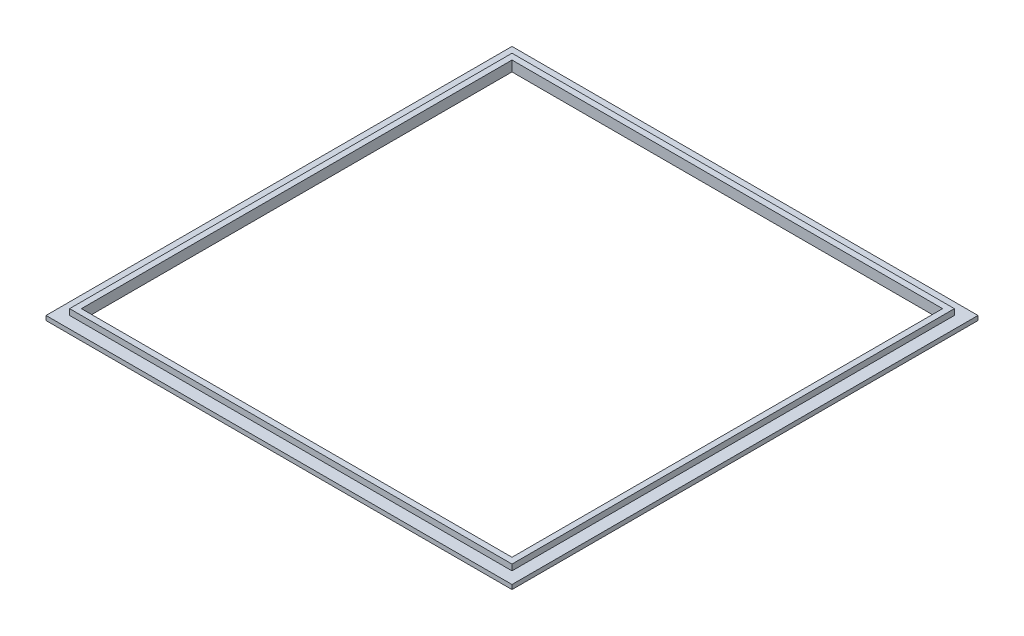
ISO-10303-21;
HEADER;
FILE_DESCRIPTION(('STEP AP214'),'2;1');
FILE_NAME('part.step','',(''),(''),'','','');
FILE_SCHEMA(('AUTOMOTIVE_DESIGN { 1 0 10303 214 1 1 1 1 }'));
ENDSEC;
DATA;
#1=APPLICATION_CONTEXT('core data for automotive mechanical design processes');
#2=APPLICATION_PROTOCOL_DEFINITION('international standard','automotive_design',2000,#1);
#3=PRODUCT_CONTEXT('',#1,'mechanical');
#4=PRODUCT('Part','Part','',(#3));
#5=PRODUCT_RELATED_PRODUCT_CATEGORY('part','',(#4));
#6=PRODUCT_DEFINITION_FORMATION('','',#4);
#7=PRODUCT_DEFINITION_CONTEXT('part definition',#1,'design');
#8=PRODUCT_DEFINITION('design','',#6,#7);
#9=PRODUCT_DEFINITION_SHAPE('','',#8);
#10=(LENGTH_UNIT() NAMED_UNIT(*) SI_UNIT(.MILLI.,.METRE.));
#11=(NAMED_UNIT(*) PLANE_ANGLE_UNIT() SI_UNIT($,.RADIAN.));
#12=(NAMED_UNIT(*) SI_UNIT($,.STERADIAN.) SOLID_ANGLE_UNIT());
#13=UNCERTAINTY_MEASURE_WITH_UNIT(LENGTH_MEASURE(1.E-05),#10,'distance_accuracy_value','');
#14=(GEOMETRIC_REPRESENTATION_CONTEXT(3) GLOBAL_UNCERTAINTY_ASSIGNED_CONTEXT((#13)) GLOBAL_UNIT_ASSIGNED_CONTEXT((#10,
#11,#12)) REPRESENTATION_CONTEXT('',''));
#15=CARTESIAN_POINT('',(0.,0.,0.));
#16=DIRECTION('',(0.,0.,1.));
#17=DIRECTION('',(1.,0.,0.));
#18=AXIS2_PLACEMENT_3D('',#15,#16,#17);
#19=CARTESIAN_POINT('',(0.,1.5,0.));
#20=DIRECTION('',(0.,1.,0.));
#21=DIRECTION('',(0.,0.,1.));
#22=AXIS2_PLACEMENT_3D('',#19,#20,#21);
#23=PLANE('',#22);
#24=DIRECTION('',(1.,0.,0.));
#25=VECTOR('',#24,1.);
#26=CARTESIAN_POINT('',(-6.,1.5,6.));
#27=LINE('',#26,#25);
#28=CARTESIAN_POINT('',(-6.,1.5,6.));
#29=VERTEX_POINT('',#28);
#30=CARTESIAN_POINT('',(152.,1.5,6.));
#31=VERTEX_POINT('',#30);
#32=EDGE_CURVE('E193',#29,#31,#27,.T.);
#33=ORIENTED_EDGE('',*,*,#32,.T.);
#34=DIRECTION('',(0.,0.,-1.));
#35=VECTOR('',#34,1.);
#36=CARTESIAN_POINT('',(152.,1.5,6.));
#37=LINE('',#36,#35);
#38=CARTESIAN_POINT('',(152.,1.5,-152.));
#39=VERTEX_POINT('',#38);
#40=EDGE_CURVE('E196',#31,#39,#37,.T.);
#41=ORIENTED_EDGE('',*,*,#40,.T.);
#42=DIRECTION('',(-1.,0.,0.));
#43=VECTOR('',#42,1.);
#44=CARTESIAN_POINT('',(-6.,1.5,-152.));
#45=LINE('',#44,#43);
#46=CARTESIAN_POINT('',(-6.,1.5,-152.));
#47=VERTEX_POINT('',#46);
#48=EDGE_CURVE('E199',#39,#47,#45,.T.);
#49=ORIENTED_EDGE('',*,*,#48,.T.);
#50=DIRECTION('',(0.,0.,1.));
#51=VECTOR('',#50,1.);
#52=CARTESIAN_POINT('',(-6.,1.5,6.));
#53=LINE('',#52,#51);
#54=EDGE_CURVE('E201',#47,#29,#53,.T.);
#55=ORIENTED_EDGE('',*,*,#54,.T.);
#56=EDGE_LOOP('',(#33,#41,#49,#55));
#57=FACE_BOUND('',#56,.T.);
#58=DIRECTION('',(-1.,0.,0.));
#59=VECTOR('',#58,1.);
#60=CARTESIAN_POINT('',(148.,1.5,-148.));
#61=LINE('',#60,#59);
#62=CARTESIAN_POINT('',(148.,1.5,-148.));
#63=VERTEX_POINT('',#62);
#64=CARTESIAN_POINT('',(-2.,1.5,-148.));
#65=VERTEX_POINT('',#64);
#66=EDGE_CURVE('E168',#63,#65,#61,.T.);
#67=ORIENTED_EDGE('',*,*,#66,.F.);
#68=DIRECTION('',(0.,0.,-1.));
#69=VECTOR('',#68,1.);
#70=CARTESIAN_POINT('',(148.,1.5,1.99999999999999));
#71=LINE('',#70,#69);
#72=CARTESIAN_POINT('',(148.,1.5,1.99999999999999));
#73=VERTEX_POINT('',#72);
#74=EDGE_CURVE('E154',#73,#63,#71,.T.);
#75=ORIENTED_EDGE('',*,*,#74,.F.);
#76=DIRECTION('',(1.,0.,0.));
#77=VECTOR('',#76,1.);
#78=CARTESIAN_POINT('',(-1.99999999999998,1.5,2.));
#79=LINE('',#78,#77);
#80=CARTESIAN_POINT('',(-1.99999999999998,1.5,2.));
#81=VERTEX_POINT('',#80);
#82=EDGE_CURVE('E159',#81,#73,#79,.T.);
#83=ORIENTED_EDGE('',*,*,#82,.F.);
#84=DIRECTION('',(0.,0.,1.));
#85=VECTOR('',#84,1.);
#86=CARTESIAN_POINT('',(-2.,1.5,-148.));
#87=LINE('',#86,#85);
#88=EDGE_CURVE('E170',#65,#81,#87,.T.);
#89=ORIENTED_EDGE('',*,*,#88,.F.);
#90=EDGE_LOOP('',(#67,#75,#83,#89));
#91=FACE_BOUND('',#90,.T.);
#92=ADVANCED_FACE('F35',(#57,#91),#23,.T.);
#93=CARTESIAN_POINT('',(0.,0.,0.));
#94=DIRECTION('',(0.,1.,0.));
#95=DIRECTION('',(0.,0.,1.));
#96=AXIS2_PLACEMENT_3D('',#93,#94,#95);
#97=PLANE('',#96);
#98=DIRECTION('',(1.,0.,0.));
#99=VECTOR('',#98,1.);
#100=CARTESIAN_POINT('',(-6.,0.,6.));
#101=LINE('',#100,#99);
#102=CARTESIAN_POINT('',(-6.,0.,6.));
#103=VERTEX_POINT('',#102);
#104=CARTESIAN_POINT('',(152.,0.,6.));
#105=VERTEX_POINT('',#104);
#106=EDGE_CURVE('E192',#103,#105,#101,.T.);
#107=ORIENTED_EDGE('',*,*,#106,.F.);
#108=DIRECTION('',(0.,0.,1.));
#109=VECTOR('',#108,1.);
#110=CARTESIAN_POINT('',(-6.,0.,6.));
#111=LINE('',#110,#109);
#112=CARTESIAN_POINT('',(-6.,0.,-152.));
#113=VERTEX_POINT('',#112);
#114=EDGE_CURVE('E197',#113,#103,#111,.T.);
#115=ORIENTED_EDGE('',*,*,#114,.F.);
#116=DIRECTION('',(-1.,0.,0.));
#117=VECTOR('',#116,1.);
#118=CARTESIAN_POINT('',(-6.,0.,-152.));
#119=LINE('',#118,#117);
#120=CARTESIAN_POINT('',(152.,0.,-152.));
#121=VERTEX_POINT('',#120);
#122=EDGE_CURVE('E208',#121,#113,#119,.T.);
#123=ORIENTED_EDGE('',*,*,#122,.F.);
#124=DIRECTION('',(0.,0.,-1.));
#125=VECTOR('',#124,1.);
#126=CARTESIAN_POINT('',(152.,0.,6.));
#127=LINE('',#126,#125);
#128=EDGE_CURVE('E206',#105,#121,#127,.T.);
#129=ORIENTED_EDGE('',*,*,#128,.F.);
#130=EDGE_LOOP('',(#107,#115,#123,#129));
#131=FACE_BOUND('',#130,.T.);
#132=DIRECTION('',(0.,0.,1.));
#133=VECTOR('',#132,1.);
#134=CARTESIAN_POINT('',(0.,0.,0.));
#135=LINE('',#134,#133);
#136=CARTESIAN_POINT('',(0.,0.,-146.));
#137=VERTEX_POINT('',#136);
#138=CARTESIAN_POINT('',(0.,0.,0.));
#139=VERTEX_POINT('',#138);
#140=EDGE_CURVE('E58',#137,#139,#135,.T.);
#141=ORIENTED_EDGE('',*,*,#140,.T.);
#142=DIRECTION('',(1.,0.,0.));
#143=VECTOR('',#142,1.);
#144=CARTESIAN_POINT('',(0.,0.,0.));
#145=LINE('',#144,#143);
#146=CARTESIAN_POINT('',(146.,0.,0.));
#147=VERTEX_POINT('',#146);
#148=EDGE_CURVE('E182',#139,#147,#145,.T.);
#149=ORIENTED_EDGE('',*,*,#148,.T.);
#150=DIRECTION('',(0.,0.,-1.));
#151=VECTOR('',#150,1.);
#152=CARTESIAN_POINT('',(146.,0.,0.));
#153=LINE('',#152,#151);
#154=CARTESIAN_POINT('',(146.,0.,-146.));
#155=VERTEX_POINT('',#154);
#156=EDGE_CURVE('E133',#147,#155,#153,.T.);
#157=ORIENTED_EDGE('',*,*,#156,.T.);
#158=DIRECTION('',(-1.,0.,0.));
#159=VECTOR('',#158,1.);
#160=CARTESIAN_POINT('',(0.,0.,-146.));
#161=LINE('',#160,#159);
#162=EDGE_CURVE('E185',#155,#137,#161,.T.);
#163=ORIENTED_EDGE('',*,*,#162,.T.);
#164=EDGE_LOOP('',(#141,#149,#157,#163));
#165=FACE_BOUND('',#164,.T.);
#166=ADVANCED_FACE('F226',(#131,#165),#97,.F.);
#167=CARTESIAN_POINT('',(-6.,1.5,6.));
#168=DIRECTION('',(0.,0.,-1.));
#169=DIRECTION('',(-1.,0.,0.));
#170=AXIS2_PLACEMENT_3D('',#167,#168,#169);
#171=PLANE('',#170);
#172=ORIENTED_EDGE('',*,*,#106,.T.);
#173=DIRECTION('',(0.,-1.,0.));
#174=VECTOR('',#173,1.);
#175=CARTESIAN_POINT('',(152.,1.5,6.));
#176=LINE('',#175,#174);
#177=EDGE_CURVE('E11',#31,#105,#176,.T.);
#178=ORIENTED_EDGE('',*,*,#177,.F.);
#179=ORIENTED_EDGE('',*,*,#32,.F.);
#180=DIRECTION('',(0.,-1.,0.));
#181=VECTOR('',#180,1.);
#182=CARTESIAN_POINT('',(-6.,1.5,6.));
#183=LINE('',#182,#181);
#184=EDGE_CURVE('E203',#29,#103,#183,.T.);
#185=ORIENTED_EDGE('',*,*,#184,.T.);
#186=EDGE_LOOP('',(#172,#178,#179,#185));
#187=FACE_BOUND('',#186,.T.);
#188=ADVANCED_FACE('F37',(#187),#171,.F.);
#189=CARTESIAN_POINT('',(152.,1.5,6.));
#190=DIRECTION('',(-1.,0.,0.));
#191=DIRECTION('',(0.,0.,1.));
#192=AXIS2_PLACEMENT_3D('',#189,#190,#191);
#193=PLANE('',#192);
#194=ORIENTED_EDGE('',*,*,#128,.T.);
#195=DIRECTION('',(0.,-1.,0.));
#196=VECTOR('',#195,1.);
#197=CARTESIAN_POINT('',(152.,1.5,-152.));
#198=LINE('',#197,#196);
#199=EDGE_CURVE('E43',#39,#121,#198,.T.);
#200=ORIENTED_EDGE('',*,*,#199,.F.);
#201=ORIENTED_EDGE('',*,*,#40,.F.);
#202=ORIENTED_EDGE('',*,*,#177,.T.);
#203=EDGE_LOOP('',(#194,#200,#201,#202));
#204=FACE_BOUND('',#203,.T.);
#205=ADVANCED_FACE('F237',(#204),#193,.F.);
#206=CARTESIAN_POINT('',(-6.,1.5,-152.));
#207=DIRECTION('',(0.,0.,1.));
#208=DIRECTION('',(1.,0.,0.));
#209=AXIS2_PLACEMENT_3D('',#206,#207,#208);
#210=PLANE('',#209);
#211=ORIENTED_EDGE('',*,*,#122,.T.);
#212=DIRECTION('',(0.,-1.,0.));
#213=VECTOR('',#212,1.);
#214=CARTESIAN_POINT('',(-6.,1.5,-152.));
#215=LINE('',#214,#213);
#216=EDGE_CURVE('E213',#47,#113,#215,.T.);
#217=ORIENTED_EDGE('',*,*,#216,.F.);
#218=ORIENTED_EDGE('',*,*,#48,.F.);
#219=ORIENTED_EDGE('',*,*,#199,.T.);
#220=EDGE_LOOP('',(#211,#217,#218,#219));
#221=FACE_BOUND('',#220,.T.);
#222=ADVANCED_FACE('F220',(#221),#210,.F.);
#223=CARTESIAN_POINT('',(-6.,1.5,6.));
#224=DIRECTION('',(1.,0.,0.));
#225=DIRECTION('',(0.,0.,-1.));
#226=AXIS2_PLACEMENT_3D('',#223,#224,#225);
#227=PLANE('',#226);
#228=ORIENTED_EDGE('',*,*,#114,.T.);
#229=ORIENTED_EDGE('',*,*,#184,.F.);
#230=ORIENTED_EDGE('',*,*,#54,.F.);
#231=ORIENTED_EDGE('',*,*,#216,.T.);
#232=EDGE_LOOP('',(#228,#229,#230,#231));
#233=FACE_BOUND('',#232,.T.);
#234=ADVANCED_FACE('F230',(#233),#227,.F.);
#235=CARTESIAN_POINT('',(0.,1.5,0.));
#236=DIRECTION('',(1.,0.,0.));
#237=DIRECTION('',(0.,0.,-1.));
#238=AXIS2_PLACEMENT_3D('',#235,#236,#237);
#239=PLANE('',#238);
#240=ORIENTED_EDGE('',*,*,#140,.F.);
#241=DIRECTION('',(0.,-1.,0.));
#242=VECTOR('',#241,1.);
#243=CARTESIAN_POINT('',(0.,1.5,-146.));
#244=LINE('',#243,#242);
#245=CARTESIAN_POINT('',(0.,3.5,-146.));
#246=VERTEX_POINT('',#245);
#247=EDGE_CURVE('E188',#246,#137,#244,.T.);
#248=ORIENTED_EDGE('',*,*,#247,.F.);
#249=DIRECTION('',(0.,0.,1.));
#250=VECTOR('',#249,1.);
#251=CARTESIAN_POINT('',(0.,3.5,-146.));
#252=LINE('',#251,#250);
#253=CARTESIAN_POINT('',(0.,3.5,0.));
#254=VERTEX_POINT('',#253);
#255=EDGE_CURVE('E150',#246,#254,#252,.T.);
#256=ORIENTED_EDGE('',*,*,#255,.T.);
#257=DIRECTION('',(0.,-1.,0.));
#258=VECTOR('',#257,1.);
#259=CARTESIAN_POINT('',(0.,1.5,0.));
#260=LINE('',#259,#258);
#261=EDGE_CURVE('E136',#254,#139,#260,.T.);
#262=ORIENTED_EDGE('',*,*,#261,.T.);
#263=EDGE_LOOP('',(#240,#248,#256,#262));
#264=FACE_BOUND('',#263,.T.);
#265=ADVANCED_FACE('F251',(#264),#239,.T.);
#266=CARTESIAN_POINT('',(0.,1.5,0.));
#267=DIRECTION('',(0.,0.,-1.));
#268=DIRECTION('',(-1.,0.,0.));
#269=AXIS2_PLACEMENT_3D('',#266,#267,#268);
#270=PLANE('',#269);
#271=ORIENTED_EDGE('',*,*,#148,.F.);
#272=ORIENTED_EDGE('',*,*,#261,.F.);
#273=DIRECTION('',(1.,0.,0.));
#274=VECTOR('',#273,1.);
#275=CARTESIAN_POINT('',(0.,3.5,0.));
#276=LINE('',#275,#274);
#277=CARTESIAN_POINT('',(146.,3.5,0.));
#278=VERTEX_POINT('',#277);
#279=EDGE_CURVE('E140',#254,#278,#276,.T.);
#280=ORIENTED_EDGE('',*,*,#279,.T.);
#281=DIRECTION('',(0.,-1.,0.));
#282=VECTOR('',#281,1.);
#283=CARTESIAN_POINT('',(146.,1.5,0.));
#284=LINE('',#283,#282);
#285=EDGE_CURVE('E126',#278,#147,#284,.T.);
#286=ORIENTED_EDGE('',*,*,#285,.T.);
#287=EDGE_LOOP('',(#271,#272,#280,#286));
#288=FACE_BOUND('',#287,.T.);
#289=ADVANCED_FACE('F141',(#288),#270,.T.);
#290=CARTESIAN_POINT('',(146.,1.5,0.));
#291=DIRECTION('',(-1.,0.,0.));
#292=DIRECTION('',(0.,0.,1.));
#293=AXIS2_PLACEMENT_3D('',#290,#291,#292);
#294=PLANE('',#293);
#295=ORIENTED_EDGE('',*,*,#156,.F.);
#296=ORIENTED_EDGE('',*,*,#285,.F.);
#297=DIRECTION('',(0.,0.,-1.));
#298=VECTOR('',#297,1.);
#299=CARTESIAN_POINT('',(146.,3.5,0.));
#300=LINE('',#299,#298);
#301=CARTESIAN_POINT('',(146.,3.5,-146.));
#302=VERTEX_POINT('',#301);
#303=EDGE_CURVE('E130',#278,#302,#300,.T.);
#304=ORIENTED_EDGE('',*,*,#303,.T.);
#305=DIRECTION('',(0.,-1.,0.));
#306=VECTOR('',#305,1.);
#307=CARTESIAN_POINT('',(146.,1.5,-146.));
#308=LINE('',#307,#306);
#309=EDGE_CURVE('E137',#302,#155,#308,.T.);
#310=ORIENTED_EDGE('',*,*,#309,.T.);
#311=EDGE_LOOP('',(#295,#296,#304,#310));
#312=FACE_BOUND('',#311,.T.);
#313=ADVANCED_FACE('F128',(#312),#294,.T.);
#314=CARTESIAN_POINT('',(0.,1.5,-146.));
#315=DIRECTION('',(0.,0.,1.));
#316=DIRECTION('',(1.,0.,0.));
#317=AXIS2_PLACEMENT_3D('',#314,#315,#316);
#318=PLANE('',#317);
#319=ORIENTED_EDGE('',*,*,#162,.F.);
#320=ORIENTED_EDGE('',*,*,#309,.F.);
#321=DIRECTION('',(-1.,0.,0.));
#322=VECTOR('',#321,1.);
#323=CARTESIAN_POINT('',(146.,3.5,-146.));
#324=LINE('',#323,#322);
#325=EDGE_CURVE('E148',#302,#246,#324,.T.);
#326=ORIENTED_EDGE('',*,*,#325,.T.);
#327=ORIENTED_EDGE('',*,*,#247,.T.);
#328=EDGE_LOOP('',(#319,#320,#326,#327));
#329=FACE_BOUND('',#328,.T.);
#330=ADVANCED_FACE('F264',(#329),#318,.T.);
#331=CARTESIAN_POINT('',(0.,3.5,0.));
#332=DIRECTION('',(0.,1.,0.));
#333=DIRECTION('',(0.,0.,1.));
#334=AXIS2_PLACEMENT_3D('',#331,#332,#333);
#335=PLANE('',#334);
#336=DIRECTION('',(0.,0.,-1.));
#337=VECTOR('',#336,1.);
#338=CARTESIAN_POINT('',(148.,3.5,1.99999999999999));
#339=LINE('',#338,#337);
#340=CARTESIAN_POINT('',(148.,3.5,1.99999999999999));
#341=VERTEX_POINT('',#340);
#342=CARTESIAN_POINT('',(148.,3.5,-148.));
#343=VERTEX_POINT('',#342);
#344=EDGE_CURVE('E155',#341,#343,#339,.T.);
#345=ORIENTED_EDGE('',*,*,#344,.T.);
#346=DIRECTION('',(-1.,0.,0.));
#347=VECTOR('',#346,1.);
#348=CARTESIAN_POINT('',(148.,3.5,-148.));
#349=LINE('',#348,#347);
#350=CARTESIAN_POINT('',(-2.,3.5,-148.));
#351=VERTEX_POINT('',#350);
#352=EDGE_CURVE('E158',#343,#351,#349,.T.);
#353=ORIENTED_EDGE('',*,*,#352,.T.);
#354=DIRECTION('',(0.,0.,1.));
#355=VECTOR('',#354,1.);
#356=CARTESIAN_POINT('',(-2.,3.5,-148.));
#357=LINE('',#356,#355);
#358=CARTESIAN_POINT('',(-1.99999999999998,3.5,2.));
#359=VERTEX_POINT('',#358);
#360=EDGE_CURVE('E161',#351,#359,#357,.T.);
#361=ORIENTED_EDGE('',*,*,#360,.T.);
#362=DIRECTION('',(1.,0.,0.));
#363=VECTOR('',#362,1.);
#364=CARTESIAN_POINT('',(-1.99999999999998,3.5,2.));
#365=LINE('',#364,#363);
#366=EDGE_CURVE('E163',#359,#341,#365,.T.);
#367=ORIENTED_EDGE('',*,*,#366,.T.);
#368=EDGE_LOOP('',(#345,#353,#361,#367));
#369=FACE_BOUND('',#368,.T.);
#370=ORIENTED_EDGE('',*,*,#303,.F.);
#371=ORIENTED_EDGE('',*,*,#279,.F.);
#372=ORIENTED_EDGE('',*,*,#255,.F.);
#373=ORIENTED_EDGE('',*,*,#325,.F.);
#374=EDGE_LOOP('',(#370,#371,#372,#373));
#375=FACE_BOUND('',#374,.T.);
#376=ADVANCED_FACE('F146',(#369,#375),#335,.T.);
#377=CARTESIAN_POINT('',(148.,3.5,1.99999999999999));
#378=DIRECTION('',(-1.,0.,0.));
#379=DIRECTION('',(0.,0.,1.));
#380=AXIS2_PLACEMENT_3D('',#377,#378,#379);
#381=PLANE('',#380);
#382=ORIENTED_EDGE('',*,*,#74,.T.);
#383=DIRECTION('',(0.,-1.,0.));
#384=VECTOR('',#383,1.);
#385=CARTESIAN_POINT('',(148.,3.5,-148.));
#386=LINE('',#385,#384);
#387=EDGE_CURVE('E179',#343,#63,#386,.T.);
#388=ORIENTED_EDGE('',*,*,#387,.F.);
#389=ORIENTED_EDGE('',*,*,#344,.F.);
#390=DIRECTION('',(0.,-1.,0.));
#391=VECTOR('',#390,1.);
#392=CARTESIAN_POINT('',(148.,3.5,1.99999999999999));
#393=LINE('',#392,#391);
#394=EDGE_CURVE('E165',#341,#73,#393,.T.);
#395=ORIENTED_EDGE('',*,*,#394,.T.);
#396=EDGE_LOOP('',(#382,#388,#389,#395));
#397=FACE_BOUND('',#396,.T.);
#398=ADVANCED_FACE('F270',(#397),#381,.F.);
#399=CARTESIAN_POINT('',(148.,3.5,-148.));
#400=DIRECTION('',(0.,0.,1.));
#401=DIRECTION('',(1.,0.,0.));
#402=AXIS2_PLACEMENT_3D('',#399,#400,#401);
#403=PLANE('',#402);
#404=ORIENTED_EDGE('',*,*,#66,.T.);
#405=DIRECTION('',(0.,-1.,0.));
#406=VECTOR('',#405,1.);
#407=CARTESIAN_POINT('',(-2.,3.5,-148.));
#408=LINE('',#407,#406);
#409=EDGE_CURVE('E176',#351,#65,#408,.T.);
#410=ORIENTED_EDGE('',*,*,#409,.F.);
#411=ORIENTED_EDGE('',*,*,#352,.F.);
#412=ORIENTED_EDGE('',*,*,#387,.T.);
#413=EDGE_LOOP('',(#404,#410,#411,#412));
#414=FACE_BOUND('',#413,.T.);
#415=ADVANCED_FACE('F273',(#414),#403,.F.);
#416=CARTESIAN_POINT('',(-2.,3.5,-148.));
#417=DIRECTION('',(1.,0.,0.));
#418=DIRECTION('',(0.,0.,-1.));
#419=AXIS2_PLACEMENT_3D('',#416,#417,#418);
#420=PLANE('',#419);
#421=ORIENTED_EDGE('',*,*,#88,.T.);
#422=DIRECTION('',(0.,-1.,0.));
#423=VECTOR('',#422,1.);
#424=CARTESIAN_POINT('',(-1.99999999999998,3.5,2.));
#425=LINE('',#424,#423);
#426=EDGE_CURVE('E50',#359,#81,#425,.T.);
#427=ORIENTED_EDGE('',*,*,#426,.F.);
#428=ORIENTED_EDGE('',*,*,#360,.F.);
#429=ORIENTED_EDGE('',*,*,#409,.T.);
#430=EDGE_LOOP('',(#421,#427,#428,#429));
#431=FACE_BOUND('',#430,.T.);
#432=ADVANCED_FACE('F277',(#431),#420,.F.);
#433=CARTESIAN_POINT('',(-1.99999999999998,3.5,2.));
#434=DIRECTION('',(0.,0.,-1.));
#435=DIRECTION('',(-1.,0.,0.));
#436=AXIS2_PLACEMENT_3D('',#433,#434,#435);
#437=PLANE('',#436);
#438=ORIENTED_EDGE('',*,*,#82,.T.);
#439=ORIENTED_EDGE('',*,*,#394,.F.);
#440=ORIENTED_EDGE('',*,*,#366,.F.);
#441=ORIENTED_EDGE('',*,*,#426,.T.);
#442=EDGE_LOOP('',(#438,#439,#440,#441));
#443=FACE_BOUND('',#442,.T.);
#444=ADVANCED_FACE('F281',(#443),#437,.F.);
#445=CLOSED_SHELL('',(#92,#166,#188,#205,#222,#234,#265,#289,#313,#330,#376,#398,#415,#432,#444));
#446=MANIFOLD_SOLID_BREP('B2',#445);
#447=ADVANCED_BREP_SHAPE_REPRESENTATION('',(#18,#446),#14);
#448=SHAPE_DEFINITION_REPRESENTATION(#9,#447);
ENDSEC;
END-ISO-10303-21;
